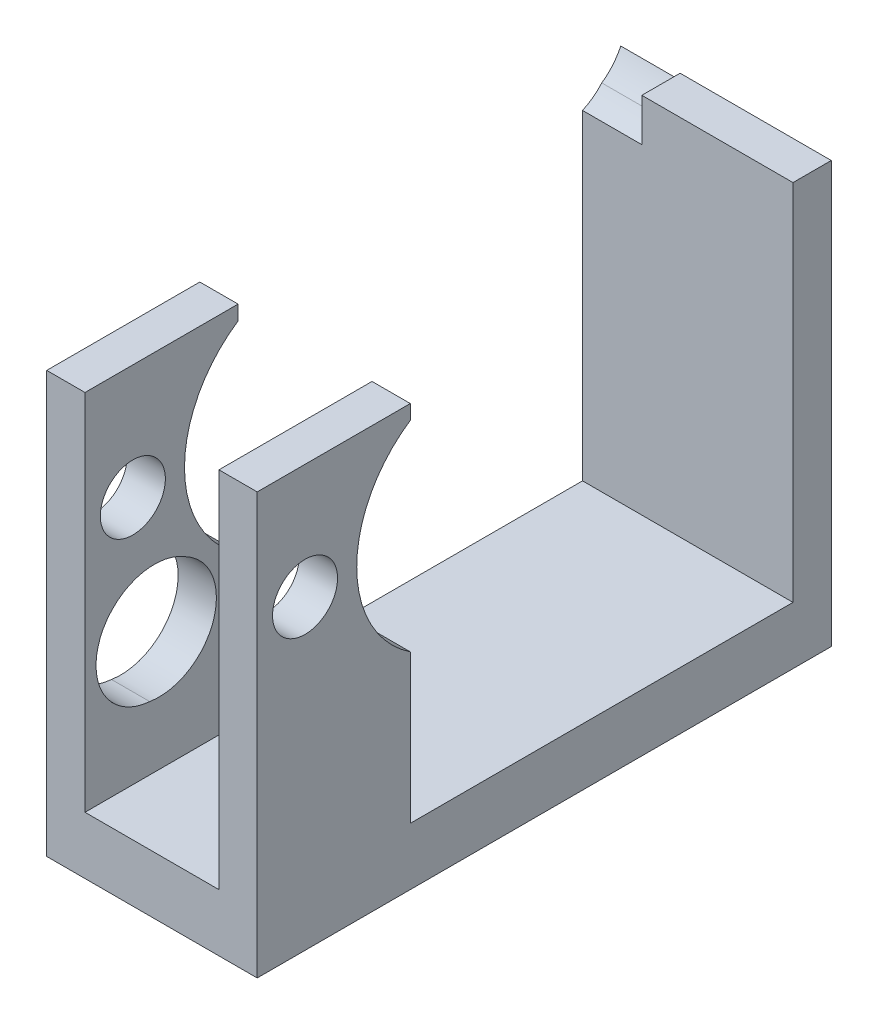
ISO-10303-21;
HEADER;
FILE_DESCRIPTION(('STEP AP214'),'2;1');
FILE_NAME('part.step','',(''),(''),'','','');
FILE_SCHEMA(('AUTOMOTIVE_DESIGN { 1 0 10303 214 1 1 1 1 }'));
ENDSEC;
DATA;
#1=APPLICATION_CONTEXT('core data for automotive mechanical design processes');
#2=APPLICATION_PROTOCOL_DEFINITION('international standard','automotive_design',2000,#1);
#3=PRODUCT_CONTEXT('',#1,'mechanical');
#4=PRODUCT('Part','Part','',(#3));
#5=PRODUCT_RELATED_PRODUCT_CATEGORY('part','',(#4));
#6=PRODUCT_DEFINITION_FORMATION('','',#4);
#7=PRODUCT_DEFINITION_CONTEXT('part definition',#1,'design');
#8=PRODUCT_DEFINITION('design','',#6,#7);
#9=PRODUCT_DEFINITION_SHAPE('','',#8);
#10=(LENGTH_UNIT() NAMED_UNIT(*) SI_UNIT(.MILLI.,.METRE.));
#11=(NAMED_UNIT(*) PLANE_ANGLE_UNIT() SI_UNIT($,.RADIAN.));
#12=(NAMED_UNIT(*) SI_UNIT($,.STERADIAN.) SOLID_ANGLE_UNIT());
#13=UNCERTAINTY_MEASURE_WITH_UNIT(LENGTH_MEASURE(1.E-05),#10,'distance_accuracy_value','');
#14=(GEOMETRIC_REPRESENTATION_CONTEXT(3) GLOBAL_UNCERTAINTY_ASSIGNED_CONTEXT((#13)) GLOBAL_UNIT_ASSIGNED_CONTEXT((#10,
#11,#12)) REPRESENTATION_CONTEXT('',''));
#15=CARTESIAN_POINT('',(0.,0.,0.));
#16=DIRECTION('',(0.,0.,1.));
#17=DIRECTION('',(1.,0.,0.));
#18=AXIS2_PLACEMENT_3D('',#15,#16,#17);
#19=CARTESIAN_POINT('',(-8.9,-35.7198777887695,-11.8675));
#20=DIRECTION('',(-1.,0.,0.));
#21=DIRECTION('',(0.,0.,1.));
#22=AXIS2_PLACEMENT_3D('',#19,#20,#21);
#23=CYLINDRICAL_SURFACE('',#22,3.);
#24=CARTESIAN_POINT('',(-10.,-35.7198777887695,-11.8675));
#25=DIRECTION('',(-1.,0.,0.));
#26=DIRECTION('',(0.,0.,1.));
#27=AXIS2_PLACEMENT_3D('',#24,#25,#26);
#28=CIRCLE('',#27,3.);
#29=CARTESIAN_POINT('',(-10.,-38.6800828893261,-11.3804827902028));
#30=VERTEX_POINT('',#29);
#31=CARTESIAN_POINT('',(-10.,-33.0507418472652,-13.2370668387377));
#32=VERTEX_POINT('',#31);
#33=EDGE_CURVE('E193',#30,#32,#28,.F.);
#34=ORIENTED_EDGE('',*,*,#33,.T.);
#35=DIRECTION('',(-1.,0.,0.));
#36=VECTOR('',#35,1.);
#37=CARTESIAN_POINT('',(-10.5,-33.0507418472652,-13.2370668387377));
#38=LINE('',#37,#36);
#39=CARTESIAN_POINT('',(-12.,-33.0507418472652,-13.2370668387377));
#40=VERTEX_POINT('',#39);
#41=EDGE_CURVE('E11',#32,#40,#38,.T.);
#42=ORIENTED_EDGE('',*,*,#41,.T.);
#43=CARTESIAN_POINT('',(-12.,-35.7198777887695,-11.8675));
#44=DIRECTION('',(1.,0.,0.));
#45=DIRECTION('',(0.,0.,-1.));
#46=AXIS2_PLACEMENT_3D('',#43,#44,#45);
#47=CIRCLE('',#46,3.);
#48=CARTESIAN_POINT('',(-12.,-38.6800828893261,-11.3804827902028));
#49=VERTEX_POINT('',#48);
#50=EDGE_CURVE('E191',#40,#49,#47,.F.);
#51=ORIENTED_EDGE('',*,*,#50,.T.);
#52=DIRECTION('',(-1.,0.,0.));
#53=VECTOR('',#52,1.);
#54=CARTESIAN_POINT('',(-10.5,-38.6800828893261,-11.3804827902028));
#55=LINE('',#54,#53);
#56=EDGE_CURVE('E47',#49,#30,#55,.F.);
#57=ORIENTED_EDGE('',*,*,#56,.T.);
#58=EDGE_LOOP('',(#34,#42,#51,#57));
#59=FACE_BOUND('',#58,.T.);
#60=ADVANCED_FACE('F41',(#59),#23,.F.);
#61=CARTESIAN_POINT('',(0.,0.,-38.));
#62=DIRECTION('',(0.,0.,1.));
#63=DIRECTION('',(1.,0.,0.));
#64=AXIS2_PLACEMENT_3D('',#61,#62,#63);
#65=PLANE('',#64);
#66=DIRECTION('',(-1.,0.,0.));
#67=VECTOR('',#66,1.);
#68=CARTESIAN_POINT('',(-8.9,-23.3190905958273,-38.));
#69=LINE('',#68,#67);
#70=CARTESIAN_POINT('',(-8.9,-23.3190905958273,-38.));
#71=VERTEX_POINT('',#70);
#72=CARTESIAN_POINT('',(-12.,-23.3190905958273,-38.));
#73=VERTEX_POINT('',#72);
#74=EDGE_CURVE('E197',#71,#73,#69,.T.);
#75=ORIENTED_EDGE('',*,*,#74,.F.);
#76=DIRECTION('',(0.,1.,0.));
#77=VECTOR('',#76,1.);
#78=CARTESIAN_POINT('',(-8.9,0.,-38.));
#79=LINE('',#78,#77);
#80=CARTESIAN_POINT('',(-8.9,-23.,-38.));
#81=VERTEX_POINT('',#80);
#82=EDGE_CURVE('E192',#71,#81,#79,.T.);
#83=ORIENTED_EDGE('',*,*,#82,.T.);
#84=DIRECTION('',(-1.,0.,0.));
#85=VECTOR('',#84,1.);
#86=CARTESIAN_POINT('',(-1.,-23.,-38.));
#87=LINE('',#86,#85);
#88=CARTESIAN_POINT('',(-1.,-23.,-38.));
#89=VERTEX_POINT('',#88);
#90=EDGE_CURVE('E302',#89,#81,#87,.T.);
#91=ORIENTED_EDGE('',*,*,#90,.F.);
#92=DIRECTION('',(0.,1.,0.));
#93=VECTOR('',#92,1.);
#94=CARTESIAN_POINT('',(-1.,-45.,-38.));
#95=LINE('',#94,#93);
#96=CARTESIAN_POINT('',(-1.,-45.,-38.));
#97=VERTEX_POINT('',#96);
#98=EDGE_CURVE('E267',#97,#89,#95,.T.);
#99=ORIENTED_EDGE('',*,*,#98,.F.);
#100=DIRECTION('',(1.,0.,0.));
#101=VECTOR('',#100,1.);
#102=CARTESIAN_POINT('',(-12.,-45.,-38.));
#103=LINE('',#102,#101);
#104=CARTESIAN_POINT('',(-12.,-45.,-38.));
#105=VERTEX_POINT('',#104);
#106=EDGE_CURVE('E266',#105,#97,#103,.T.);
#107=ORIENTED_EDGE('',*,*,#106,.F.);
#108=DIRECTION('',(0.,-1.,0.));
#109=VECTOR('',#108,1.);
#110=CARTESIAN_POINT('',(-12.,-42.,-38.));
#111=LINE('',#110,#109);
#112=EDGE_CURVE('E275',#73,#105,#111,.T.);
#113=ORIENTED_EDGE('',*,*,#112,.F.);
#114=EDGE_LOOP('',(#75,#83,#91,#99,#107,#113));
#115=FACE_BOUND('',#114,.T.);
#116=ADVANCED_FACE('F352',(#115),#65,.F.);
#117=CARTESIAN_POINT('',(-8.9,-22.5,-34.765));
#118=DIRECTION('',(-1.,0.,0.));
#119=DIRECTION('',(0.,0.,1.));
#120=AXIS2_PLACEMENT_3D('',#117,#118,#119);
#121=CYLINDRICAL_SURFACE('',#120,3.);
#122=CARTESIAN_POINT('',(-8.9,-22.5,-34.765));
#123=DIRECTION('',(1.,0.,0.));
#124=DIRECTION('',(0.,0.,-1.));
#125=AXIS2_PLACEMENT_3D('',#122,#123,#124);
#126=CIRCLE('',#125,3.);
#127=CARTESIAN_POINT('',(-8.9,-25.23400347476,-36.));
#128=VERTEX_POINT('',#127);
#129=CARTESIAN_POINT('',(-8.9,-24.4926321294143,-37.007636215891));
#130=VERTEX_POINT('',#129);
#131=EDGE_CURVE('E196',#128,#130,#126,.T.);
#132=ORIENTED_EDGE('',*,*,#131,.T.);
#133=DIRECTION('',(-1.,0.,0.));
#134=VECTOR('',#133,1.);
#135=CARTESIAN_POINT('',(-10.5,-24.4926321294143,-37.007636215891));
#136=LINE('',#135,#134);
#137=CARTESIAN_POINT('',(-12.,-24.4926321294143,-37.007636215891));
#138=VERTEX_POINT('',#137);
#139=EDGE_CURVE('E339',#130,#138,#136,.T.);
#140=ORIENTED_EDGE('',*,*,#139,.T.);
#141=CARTESIAN_POINT('',(-12.,-22.5,-34.765));
#142=DIRECTION('',(1.,0.,0.));
#143=DIRECTION('',(0.,0.,-1.));
#144=AXIS2_PLACEMENT_3D('',#141,#142,#143);
#145=CIRCLE('',#144,3.);
#146=CARTESIAN_POINT('',(-12.,-25.23400347476,-36.));
#147=VERTEX_POINT('',#146);
#148=EDGE_CURVE('E332',#138,#147,#145,.F.);
#149=ORIENTED_EDGE('',*,*,#148,.T.);
#150=DIRECTION('',(-1.,0.,0.));
#151=VECTOR('',#150,1.);
#152=CARTESIAN_POINT('',(-8.9,-25.23400347476,-36.));
#153=LINE('',#152,#151);
#154=EDGE_CURVE('E208',#128,#147,#153,.T.);
#155=ORIENTED_EDGE('',*,*,#154,.F.);
#156=EDGE_LOOP('',(#132,#140,#149,#155));
#157=FACE_BOUND('',#156,.T.);
#158=ADVANCED_FACE('F408',(#157),#121,.F.);
#159=CARTESIAN_POINT('',(0.,0.,-36.));
#160=DIRECTION('',(0.,0.,1.));
#161=DIRECTION('',(1.,0.,0.));
#162=AXIS2_PLACEMENT_3D('',#159,#160,#161);
#163=PLANE('',#162);
#164=DIRECTION('',(0.,1.,0.));
#165=VECTOR('',#164,1.);
#166=CARTESIAN_POINT('',(-8.9,0.,-36.));
#167=LINE('',#166,#165);
#168=CARTESIAN_POINT('',(-8.9,-23.,-36.));
#169=VERTEX_POINT('',#168);
#170=EDGE_CURVE('E335',#128,#169,#167,.T.);
#171=ORIENTED_EDGE('',*,*,#170,.F.);
#172=ORIENTED_EDGE('',*,*,#154,.T.);
#173=DIRECTION('',(0.,-1.,0.));
#174=VECTOR('',#173,1.);
#175=CARTESIAN_POINT('',(-12.,-23.,-36.));
#176=LINE('',#175,#174);
#177=CARTESIAN_POINT('',(-12.,-42.,-36.));
#178=VERTEX_POINT('',#177);
#179=EDGE_CURVE('E310',#147,#178,#176,.T.);
#180=ORIENTED_EDGE('',*,*,#179,.T.);
#181=DIRECTION('',(-1.,0.,0.));
#182=VECTOR('',#181,1.);
#183=CARTESIAN_POINT('',(-1.,-42.,-36.));
#184=LINE('',#183,#182);
#185=CARTESIAN_POINT('',(-1.,-42.,-36.));
#186=VERTEX_POINT('',#185);
#187=EDGE_CURVE('E300',#186,#178,#184,.T.);
#188=ORIENTED_EDGE('',*,*,#187,.F.);
#189=DIRECTION('',(0.,1.,0.));
#190=VECTOR('',#189,1.);
#191=CARTESIAN_POINT('',(-1.,-45.,-36.));
#192=LINE('',#191,#190);
#193=CARTESIAN_POINT('',(-1.,-23.,-36.));
#194=VERTEX_POINT('',#193);
#195=EDGE_CURVE('E311',#186,#194,#192,.T.);
#196=ORIENTED_EDGE('',*,*,#195,.T.);
#197=DIRECTION('',(-1.,0.,0.));
#198=VECTOR('',#197,1.);
#199=CARTESIAN_POINT('',(-1.,-23.,-36.));
#200=LINE('',#199,#198);
#201=EDGE_CURVE('E303',#194,#169,#200,.T.);
#202=ORIENTED_EDGE('',*,*,#201,.T.);
#203=EDGE_LOOP('',(#171,#172,#180,#188,#196,#202));
#204=FACE_BOUND('',#203,.T.);
#205=ADVANCED_FACE('F400',(#204),#163,.T.);
#206=CARTESIAN_POINT('',(-1.,-23.,-36.));
#207=DIRECTION('',(0.,-1.,0.));
#208=DIRECTION('',(0.,0.,-1.));
#209=AXIS2_PLACEMENT_3D('',#206,#207,#208);
#210=PLANE('',#209);
#211=ORIENTED_EDGE('',*,*,#90,.T.);
#212=DIRECTION('',(0.,0.,1.));
#213=VECTOR('',#212,1.);
#214=CARTESIAN_POINT('',(-8.9,-23.,-36.));
#215=LINE('',#214,#213);
#216=EDGE_CURVE('E189',#81,#169,#215,.T.);
#217=ORIENTED_EDGE('',*,*,#216,.T.);
#218=ORIENTED_EDGE('',*,*,#201,.F.);
#219=DIRECTION('',(0.,0.,-1.));
#220=VECTOR('',#219,1.);
#221=CARTESIAN_POINT('',(-1.,-23.,-36.));
#222=LINE('',#221,#220);
#223=EDGE_CURVE('E297',#194,#89,#222,.T.);
#224=ORIENTED_EDGE('',*,*,#223,.T.);
#225=EDGE_LOOP('',(#211,#217,#218,#224));
#226=FACE_BOUND('',#225,.T.);
#227=ADVANCED_FACE('F409',(#226),#210,.F.);
#228=CARTESIAN_POINT('',(0.,0.,-16.));
#229=DIRECTION('',(0.,0.,1.));
#230=DIRECTION('',(1.,0.,0.));
#231=AXIS2_PLACEMENT_3D('',#228,#229,#230);
#232=PLANE('',#231);
#233=DIRECTION('',(-1.,0.,0.));
#234=VECTOR('',#233,1.);
#235=CARTESIAN_POINT('',(-0.799999999999999,-23.7616796585165,-16.));
#236=LINE('',#235,#234);
#237=CARTESIAN_POINT('',(-12.,-23.7616796585165,-16.));
#238=VERTEX_POINT('',#237);
#239=CARTESIAN_POINT('',(-10.,-23.7616796585165,-16.));
#240=VERTEX_POINT('',#239);
#241=EDGE_CURVE('E314',#238,#240,#236,.F.);
#242=ORIENTED_EDGE('',*,*,#241,.F.);
#243=DIRECTION('',(0.,-1.,0.));
#244=VECTOR('',#243,1.);
#245=CARTESIAN_POINT('',(-12.,-23.,-16.));
#246=LINE('',#245,#244);
#247=CARTESIAN_POINT('',(-12.,-23.,-16.));
#248=VERTEX_POINT('',#247);
#249=EDGE_CURVE('E242',#248,#238,#246,.T.);
#250=ORIENTED_EDGE('',*,*,#249,.F.);
#251=DIRECTION('',(-1.,0.,0.));
#252=VECTOR('',#251,1.);
#253=CARTESIAN_POINT('',(-10.,-23.,-16.));
#254=LINE('',#253,#252);
#255=CARTESIAN_POINT('',(-10.,-23.,-16.));
#256=VERTEX_POINT('',#255);
#257=EDGE_CURVE('E240',#256,#248,#254,.T.);
#258=ORIENTED_EDGE('',*,*,#257,.F.);
#259=DIRECTION('',(0.,1.,0.));
#260=VECTOR('',#259,1.);
#261=CARTESIAN_POINT('',(-10.,-45.,-16.));
#262=LINE('',#261,#260);
#263=EDGE_CURVE('E243',#240,#256,#262,.T.);
#264=ORIENTED_EDGE('',*,*,#263,.F.);
#265=EDGE_LOOP('',(#242,#250,#258,#264));
#266=FACE_BOUND('',#265,.T.);
#267=ADVANCED_FACE('F374',(#266),#232,.F.);
#268=DIRECTION('',(-1.,0.,0.));
#269=VECTOR('',#268,1.);
#270=CARTESIAN_POINT('',(-0.799999999999999,-34.2383203414835,-16.));
#271=LINE('',#270,#269);
#272=CARTESIAN_POINT('',(-10.,-34.2383203414835,-16.));
#273=VERTEX_POINT('',#272);
#274=CARTESIAN_POINT('',(-12.,-34.2383203414835,-16.));
#275=VERTEX_POINT('',#274);
#276=EDGE_CURVE('E320',#273,#275,#271,.T.);
#277=ORIENTED_EDGE('',*,*,#276,.F.);
#278=CARTESIAN_POINT('',(-10.,-42.,-16.));
#279=VERTEX_POINT('',#278);
#280=EDGE_CURVE('E239',#279,#273,#262,.T.);
#281=ORIENTED_EDGE('',*,*,#280,.F.);
#282=DIRECTION('',(1.,0.,0.));
#283=VECTOR('',#282,1.);
#284=CARTESIAN_POINT('',(0.,-42.,-16.));
#285=LINE('',#284,#283);
#286=CARTESIAN_POINT('',(-12.,-42.,-16.));
#287=VERTEX_POINT('',#286);
#288=EDGE_CURVE('E221',#287,#279,#285,.T.);
#289=ORIENTED_EDGE('',*,*,#288,.F.);
#290=EDGE_CURVE('E250',#275,#287,#246,.T.);
#291=ORIENTED_EDGE('',*,*,#290,.F.);
#292=EDGE_LOOP('',(#277,#281,#289,#291));
#293=FACE_BOUND('',#292,.T.);
#294=ADVANCED_FACE('F390',(#293),#232,.F.);
#295=CARTESIAN_POINT('',(0.,0.,-16.));
#296=DIRECTION('',(0.,0.,1.));
#297=DIRECTION('',(1.,0.,0.));
#298=AXIS2_PLACEMENT_3D('',#295,#296,#297);
#299=PLANE('',#298);
#300=DIRECTION('',(-1.,0.,0.));
#301=VECTOR('',#300,1.);
#302=CARTESIAN_POINT('',(-0.799999999999999,-23.7616796585165,-16.));
#303=LINE('',#302,#301);
#304=CARTESIAN_POINT('',(-3.,-23.7616796585165,-16.));
#305=VERTEX_POINT('',#304);
#306=CARTESIAN_POINT('',(-1.,-23.7616796585165,-16.));
#307=VERTEX_POINT('',#306);
#308=EDGE_CURVE('E203',#305,#307,#303,.F.);
#309=ORIENTED_EDGE('',*,*,#308,.F.);
#310=DIRECTION('',(0.,-1.,0.));
#311=VECTOR('',#310,1.);
#312=CARTESIAN_POINT('',(-3.,-23.,-16.));
#313=LINE('',#312,#311);
#314=CARTESIAN_POINT('',(-3.,-23.,-16.));
#315=VERTEX_POINT('',#314);
#316=EDGE_CURVE('E288',#315,#305,#313,.T.);
#317=ORIENTED_EDGE('',*,*,#316,.F.);
#318=DIRECTION('',(-1.,0.,0.));
#319=VECTOR('',#318,1.);
#320=CARTESIAN_POINT('',(-1.,-23.,-16.));
#321=LINE('',#320,#319);
#322=CARTESIAN_POINT('',(-1.,-23.,-16.));
#323=VERTEX_POINT('',#322);
#324=EDGE_CURVE('E285',#323,#315,#321,.T.);
#325=ORIENTED_EDGE('',*,*,#324,.F.);
#326=DIRECTION('',(0.,1.,0.));
#327=VECTOR('',#326,1.);
#328=CARTESIAN_POINT('',(-1.,-45.,-16.));
#329=LINE('',#328,#327);
#330=EDGE_CURVE('E286',#307,#323,#329,.T.);
#331=ORIENTED_EDGE('',*,*,#330,.F.);
#332=EDGE_LOOP('',(#309,#317,#325,#331));
#333=FACE_BOUND('',#332,.T.);
#334=ADVANCED_FACE('F449',(#333),#299,.F.);
#335=DIRECTION('',(-1.,0.,0.));
#336=VECTOR('',#335,1.);
#337=CARTESIAN_POINT('',(-0.799999999999999,-34.2383203414835,-16.));
#338=LINE('',#337,#336);
#339=CARTESIAN_POINT('',(-1.,-34.2383203414835,-16.));
#340=VERTEX_POINT('',#339);
#341=CARTESIAN_POINT('',(-3.,-34.2383203414835,-16.));
#342=VERTEX_POINT('',#341);
#343=EDGE_CURVE('E219',#340,#342,#338,.T.);
#344=ORIENTED_EDGE('',*,*,#343,.F.);
#345=CARTESIAN_POINT('',(-1.,-42.,-16.));
#346=VERTEX_POINT('',#345);
#347=EDGE_CURVE('E287',#346,#340,#329,.T.);
#348=ORIENTED_EDGE('',*,*,#347,.F.);
#349=DIRECTION('',(-1.,0.,0.));
#350=VECTOR('',#349,1.);
#351=CARTESIAN_POINT('',(-1.,-42.,-16.));
#352=LINE('',#351,#350);
#353=CARTESIAN_POINT('',(-3.,-42.,-16.));
#354=VERTEX_POINT('',#353);
#355=EDGE_CURVE('E222',#346,#354,#352,.T.);
#356=ORIENTED_EDGE('',*,*,#355,.T.);
#357=EDGE_CURVE('E291',#342,#354,#313,.T.);
#358=ORIENTED_EDGE('',*,*,#357,.F.);
#359=EDGE_LOOP('',(#344,#348,#356,#358));
#360=FACE_BOUND('',#359,.T.);
#361=ADVANCED_FACE('F454',(#360),#299,.F.);
#362=CARTESIAN_POINT('',(-1.,-42.,-8.));
#363=DIRECTION('',(0.,-1.,0.));
#364=DIRECTION('',(0.,0.,-1.));
#365=AXIS2_PLACEMENT_3D('',#362,#363,#364);
#366=PLANE('',#365);
#367=DIRECTION('',(0.,0.,-1.));
#368=VECTOR('',#367,1.);
#369=CARTESIAN_POINT('',(-1.,-42.,-8.));
#370=LINE('',#369,#368);
#371=EDGE_CURVE('E258',#346,#186,#370,.T.);
#372=ORIENTED_EDGE('',*,*,#371,.T.);
#373=ORIENTED_EDGE('',*,*,#187,.T.);
#374=DIRECTION('',(0.,0.,-1.));
#375=VECTOR('',#374,1.);
#376=CARTESIAN_POINT('',(-12.,-42.,-8.));
#377=LINE('',#376,#375);
#378=EDGE_CURVE('E261',#287,#178,#377,.T.);
#379=ORIENTED_EDGE('',*,*,#378,.F.);
#380=ORIENTED_EDGE('',*,*,#288,.T.);
#381=DIRECTION('',(0.,0.,1.));
#382=VECTOR('',#381,1.);
#383=CARTESIAN_POINT('',(-10.,-42.,-8.));
#384=LINE('',#383,#382);
#385=CARTESIAN_POINT('',(-10.,-42.,-8.));
#386=VERTEX_POINT('',#385);
#387=EDGE_CURVE('E251',#279,#386,#384,.T.);
#388=ORIENTED_EDGE('',*,*,#387,.T.);
#389=DIRECTION('',(-1.,0.,0.));
#390=VECTOR('',#389,1.);
#391=CARTESIAN_POINT('',(-1.,-42.,-8.));
#392=LINE('',#391,#390);
#393=CARTESIAN_POINT('',(-3.,-42.,-8.));
#394=VERTEX_POINT('',#393);
#395=EDGE_CURVE('E262',#394,#386,#392,.T.);
#396=ORIENTED_EDGE('',*,*,#395,.F.);
#397=DIRECTION('',(0.,0.,1.));
#398=VECTOR('',#397,1.);
#399=CARTESIAN_POINT('',(-3.,-42.,-8.));
#400=LINE('',#399,#398);
#401=EDGE_CURVE('E220',#354,#394,#400,.T.);
#402=ORIENTED_EDGE('',*,*,#401,.F.);
#403=ORIENTED_EDGE('',*,*,#355,.F.);
#404=EDGE_LOOP('',(#372,#373,#379,#380,#388,#396,#402,#403));
#405=FACE_BOUND('',#404,.T.);
#406=ADVANCED_FACE('F395',(#405),#366,.F.);
#407=CARTESIAN_POINT('',(-10.,-45.,-8.));
#408=DIRECTION('',(-1.,0.,0.));
#409=DIRECTION('',(0.,0.,1.));
#410=AXIS2_PLACEMENT_3D('',#407,#408,#409);
#411=PLANE('',#410);
#412=CARTESIAN_POINT('',(-10.,-35.6399001096049,-11.625));
#413=DIRECTION('',(-1.,0.,0.));
#414=DIRECTION('',(0.,0.,1.));
#415=AXIS2_PLACEMENT_3D('',#412,#413,#414);
#416=CIRCLE('',#415,3.05);
#417=EDGE_CURVE('E57',#32,#30,#416,.F.);
#418=ORIENTED_EDGE('',*,*,#417,.F.);
#419=ORIENTED_EDGE('',*,*,#33,.F.);
#420=EDGE_LOOP('',(#418,#419));
#421=FACE_BOUND('',#420,.T.);
#422=CARTESIAN_POINT('',(-10.,-29.,-10.5));
#423=DIRECTION('',(-1.,0.,0.));
#424=DIRECTION('',(0.,0.,1.));
#425=AXIS2_PLACEMENT_3D('',#422,#423,#424);
#426=CIRCLE('',#425,1.7);
#427=CARTESIAN_POINT('',(-10.,-29.,-8.8));
#428=VERTEX_POINT('',#427);
#429=EDGE_CURVE('E213',#428,#428,#426,.F.);
#430=ORIENTED_EDGE('',*,*,#429,.F.);
#431=EDGE_LOOP('',(#430));
#432=FACE_BOUND('',#431,.T.);
#433=CARTESIAN_POINT('',(-10.,-29.,-19.5));
#434=DIRECTION('',(-1.,0.,0.));
#435=DIRECTION('',(0.,0.,1.));
#436=AXIS2_PLACEMENT_3D('',#433,#434,#435);
#437=CIRCLE('',#436,6.3);
#438=EDGE_CURVE('E308',#240,#273,#437,.F.);
#439=ORIENTED_EDGE('',*,*,#438,.F.);
#440=ORIENTED_EDGE('',*,*,#263,.T.);
#441=DIRECTION('',(0.,0.,-1.));
#442=VECTOR('',#441,1.);
#443=CARTESIAN_POINT('',(-10.,-23.,-8.));
#444=LINE('',#443,#442);
#445=CARTESIAN_POINT('',(-10.,-23.,-8.));
#446=VERTEX_POINT('',#445);
#447=EDGE_CURVE('E229',#446,#256,#444,.T.);
#448=ORIENTED_EDGE('',*,*,#447,.F.);
#449=DIRECTION('',(0.,1.,0.));
#450=VECTOR('',#449,1.);
#451=CARTESIAN_POINT('',(-10.,-45.,-8.));
#452=LINE('',#451,#450);
#453=EDGE_CURVE('E248',#386,#446,#452,.T.);
#454=ORIENTED_EDGE('',*,*,#453,.F.);
#455=ORIENTED_EDGE('',*,*,#387,.F.);
#456=ORIENTED_EDGE('',*,*,#280,.T.);
#457=EDGE_LOOP('',(#439,#440,#448,#454,#455,#456));
#458=FACE_BOUND('',#457,.T.);
#459=ADVANCED_FACE('F385',(#421,#432,#458),#411,.F.);
#460=CARTESIAN_POINT('',(-12.,-23.,-8.));
#461=DIRECTION('',(1.,0.,0.));
#462=DIRECTION('',(0.,0.,-1.));
#463=AXIS2_PLACEMENT_3D('',#460,#461,#462);
#464=PLANE('',#463);
#465=CARTESIAN_POINT('',(-12.,-35.6399001096049,-11.625));
#466=DIRECTION('',(1.,0.,0.));
#467=DIRECTION('',(0.,0.,-1.));
#468=AXIS2_PLACEMENT_3D('',#465,#466,#467);
#469=CIRCLE('',#468,3.05);
#470=EDGE_CURVE('E182',#49,#40,#469,.F.);
#471=ORIENTED_EDGE('',*,*,#470,.F.);
#472=ORIENTED_EDGE('',*,*,#50,.F.);
#473=EDGE_LOOP('',(#471,#472));
#474=FACE_BOUND('',#473,.T.);
#475=CARTESIAN_POINT('',(-12.,-22.,-35.25));
#476=DIRECTION('',(1.,0.,0.));
#477=DIRECTION('',(0.,0.,-1.));
#478=AXIS2_PLACEMENT_3D('',#475,#476,#477);
#479=CIRCLE('',#478,3.05);
#480=EDGE_CURVE('E63',#73,#138,#479,.F.);
#481=ORIENTED_EDGE('',*,*,#480,.F.);
#482=ORIENTED_EDGE('',*,*,#112,.T.);
#483=DIRECTION('',(0.,0.,-1.));
#484=VECTOR('',#483,1.);
#485=CARTESIAN_POINT('',(-12.,-45.,-8.));
#486=LINE('',#485,#484);
#487=CARTESIAN_POINT('',(-12.,-45.,-8.));
#488=VERTEX_POINT('',#487);
#489=EDGE_CURVE('E227',#488,#105,#486,.T.);
#490=ORIENTED_EDGE('',*,*,#489,.F.);
#491=DIRECTION('',(0.,-1.,0.));
#492=VECTOR('',#491,1.);
#493=CARTESIAN_POINT('',(-12.,-23.,-8.));
#494=LINE('',#493,#492);
#495=CARTESIAN_POINT('',(-12.,-23.,-8.));
#496=VERTEX_POINT('',#495);
#497=EDGE_CURVE('E237',#496,#488,#494,.T.);
#498=ORIENTED_EDGE('',*,*,#497,.F.);
#499=DIRECTION('',(0.,0.,-1.));
#500=VECTOR('',#499,1.);
#501=CARTESIAN_POINT('',(-12.,-23.,-8.));
#502=LINE('',#501,#500);
#503=EDGE_CURVE('E231',#496,#248,#502,.T.);
#504=ORIENTED_EDGE('',*,*,#503,.T.);
#505=ORIENTED_EDGE('',*,*,#249,.T.);
#506=CARTESIAN_POINT('',(-12.,-29.,-19.5));
#507=DIRECTION('',(1.,0.,0.));
#508=DIRECTION('',(0.,0.,-1.));
#509=AXIS2_PLACEMENT_3D('',#506,#507,#508);
#510=CIRCLE('',#509,6.3);
#511=EDGE_CURVE('E316',#275,#238,#510,.F.);
#512=ORIENTED_EDGE('',*,*,#511,.F.);
#513=ORIENTED_EDGE('',*,*,#290,.T.);
#514=ORIENTED_EDGE('',*,*,#378,.T.);
#515=ORIENTED_EDGE('',*,*,#179,.F.);
#516=ORIENTED_EDGE('',*,*,#148,.F.);
#517=EDGE_LOOP('',(#481,#482,#490,#498,#504,#505,#512,#513,#514,#515,#516));
#518=FACE_BOUND('',#517,.T.);
#519=CARTESIAN_POINT('',(-12.,-29.,-10.5));
#520=DIRECTION('',(1.,0.,0.));
#521=DIRECTION('',(0.,0.,-1.));
#522=AXIS2_PLACEMENT_3D('',#519,#520,#521);
#523=CIRCLE('',#522,1.7);
#524=CARTESIAN_POINT('',(-12.,-29.,-12.2));
#525=VERTEX_POINT('',#524);
#526=EDGE_CURVE('E214',#525,#525,#523,.F.);
#527=ORIENTED_EDGE('',*,*,#526,.F.);
#528=EDGE_LOOP('',(#527));
#529=FACE_BOUND('',#528,.T.);
#530=ADVANCED_FACE('F43',(#474,#518,#529),#464,.F.);
#531=CARTESIAN_POINT('',(-12.,-45.,-8.));
#532=DIRECTION('',(0.,1.,0.));
#533=DIRECTION('',(0.,0.,1.));
#534=AXIS2_PLACEMENT_3D('',#531,#532,#533);
#535=PLANE('',#534);
#536=ORIENTED_EDGE('',*,*,#489,.T.);
#537=ORIENTED_EDGE('',*,*,#106,.T.);
#538=DIRECTION('',(0.,0.,-1.));
#539=VECTOR('',#538,1.);
#540=CARTESIAN_POINT('',(-1.,-45.,-8.));
#541=LINE('',#540,#539);
#542=CARTESIAN_POINT('',(-1.,-45.,-8.));
#543=VERTEX_POINT('',#542);
#544=EDGE_CURVE('E256',#543,#97,#541,.T.);
#545=ORIENTED_EDGE('',*,*,#544,.F.);
#546=DIRECTION('',(1.,0.,0.));
#547=VECTOR('',#546,1.);
#548=CARTESIAN_POINT('',(-12.,-45.,-8.));
#549=LINE('',#548,#547);
#550=EDGE_CURVE('E252',#488,#543,#549,.T.);
#551=ORIENTED_EDGE('',*,*,#550,.F.);
#552=EDGE_LOOP('',(#536,#537,#545,#551));
#553=FACE_BOUND('',#552,.T.);
#554=ADVANCED_FACE('F363',(#553),#535,.F.);
#555=CARTESIAN_POINT('',(-10.,-23.,-8.));
#556=DIRECTION('',(0.,-1.,0.));
#557=DIRECTION('',(0.,0.,-1.));
#558=AXIS2_PLACEMENT_3D('',#555,#556,#557);
#559=PLANE('',#558);
#560=ORIENTED_EDGE('',*,*,#257,.T.);
#561=ORIENTED_EDGE('',*,*,#503,.F.);
#562=DIRECTION('',(-1.,0.,0.));
#563=VECTOR('',#562,1.);
#564=CARTESIAN_POINT('',(-10.,-23.,-8.));
#565=LINE('',#564,#563);
#566=EDGE_CURVE('E236',#446,#496,#565,.T.);
#567=ORIENTED_EDGE('',*,*,#566,.F.);
#568=ORIENTED_EDGE('',*,*,#447,.T.);
#569=EDGE_LOOP('',(#560,#561,#567,#568));
#570=FACE_BOUND('',#569,.T.);
#571=ADVANCED_FACE('F470',(#570),#559,.F.);
#572=CARTESIAN_POINT('',(0.,0.,-8.));
#573=DIRECTION('',(0.,0.,1.));
#574=DIRECTION('',(1.,0.,0.));
#575=AXIS2_PLACEMENT_3D('',#572,#573,#574);
#576=PLANE('',#575);
#577=ORIENTED_EDGE('',*,*,#550,.T.);
#578=DIRECTION('',(0.,1.,0.));
#579=VECTOR('',#578,1.);
#580=CARTESIAN_POINT('',(-1.,-45.,-8.));
#581=LINE('',#580,#579);
#582=CARTESIAN_POINT('',(-1.,-23.,-8.));
#583=VERTEX_POINT('',#582);
#584=EDGE_CURVE('E270',#543,#583,#581,.T.);
#585=ORIENTED_EDGE('',*,*,#584,.T.);
#586=DIRECTION('',(-1.,0.,0.));
#587=VECTOR('',#586,1.);
#588=CARTESIAN_POINT('',(-1.,-23.,-8.));
#589=LINE('',#588,#587);
#590=CARTESIAN_POINT('',(-3.,-23.,-8.));
#591=VERTEX_POINT('',#590);
#592=EDGE_CURVE('E281',#583,#591,#589,.T.);
#593=ORIENTED_EDGE('',*,*,#592,.T.);
#594=DIRECTION('',(0.,-1.,0.));
#595=VECTOR('',#594,1.);
#596=CARTESIAN_POINT('',(-3.,-23.,-8.));
#597=LINE('',#596,#595);
#598=EDGE_CURVE('E282',#591,#394,#597,.T.);
#599=ORIENTED_EDGE('',*,*,#598,.T.);
#600=ORIENTED_EDGE('',*,*,#395,.T.);
#601=ORIENTED_EDGE('',*,*,#453,.T.);
#602=ORIENTED_EDGE('',*,*,#566,.T.);
#603=ORIENTED_EDGE('',*,*,#497,.T.);
#604=EDGE_LOOP('',(#577,#585,#593,#599,#600,#601,#602,#603));
#605=FACE_BOUND('',#604,.T.);
#606=ADVANCED_FACE('F362',(#605),#576,.T.);
#607=CARTESIAN_POINT('',(-1.,-45.,-8.));
#608=DIRECTION('',(-1.,0.,0.));
#609=DIRECTION('',(0.,0.,1.));
#610=AXIS2_PLACEMENT_3D('',#607,#608,#609);
#611=PLANE('',#610);
#612=CARTESIAN_POINT('',(-1.,-29.,-10.5));
#613=DIRECTION('',(-1.,0.,0.));
#614=DIRECTION('',(0.,0.,1.));
#615=AXIS2_PLACEMENT_3D('',#612,#613,#614);
#616=CIRCLE('',#615,1.7);
#617=CARTESIAN_POINT('',(-1.,-29.,-8.8));
#618=VERTEX_POINT('',#617);
#619=EDGE_CURVE('E209',#618,#618,#616,.F.);
#620=ORIENTED_EDGE('',*,*,#619,.F.);
#621=EDGE_LOOP('',(#620));
#622=FACE_BOUND('',#621,.T.);
#623=CARTESIAN_POINT('',(-1.,-29.,-19.5));
#624=DIRECTION('',(-1.,0.,0.));
#625=DIRECTION('',(0.,0.,1.));
#626=AXIS2_PLACEMENT_3D('',#623,#624,#625);
#627=CIRCLE('',#626,6.3);
#628=EDGE_CURVE('E324',#307,#340,#627,.F.);
#629=ORIENTED_EDGE('',*,*,#628,.F.);
#630=ORIENTED_EDGE('',*,*,#330,.T.);
#631=DIRECTION('',(0.,0.,-1.));
#632=VECTOR('',#631,1.);
#633=CARTESIAN_POINT('',(-1.,-23.,-8.));
#634=LINE('',#633,#632);
#635=EDGE_CURVE('E274',#583,#323,#634,.T.);
#636=ORIENTED_EDGE('',*,*,#635,.F.);
#637=ORIENTED_EDGE('',*,*,#584,.F.);
#638=ORIENTED_EDGE('',*,*,#544,.T.);
#639=ORIENTED_EDGE('',*,*,#98,.T.);
#640=ORIENTED_EDGE('',*,*,#223,.F.);
#641=ORIENTED_EDGE('',*,*,#195,.F.);
#642=ORIENTED_EDGE('',*,*,#371,.F.);
#643=ORIENTED_EDGE('',*,*,#347,.T.);
#644=EDGE_LOOP('',(#629,#630,#636,#637,#638,#639,#640,#641,#642,#643));
#645=FACE_BOUND('',#644,.T.);
#646=ADVANCED_FACE('F405',(#622,#645),#611,.F.);
#647=CARTESIAN_POINT('',(-3.,-23.,-8.));
#648=DIRECTION('',(1.,0.,0.));
#649=DIRECTION('',(0.,0.,-1.));
#650=AXIS2_PLACEMENT_3D('',#647,#648,#649);
#651=PLANE('',#650);
#652=CARTESIAN_POINT('',(-3.,-29.,-10.5));
#653=DIRECTION('',(1.,0.,0.));
#654=DIRECTION('',(0.,0.,-1.));
#655=AXIS2_PLACEMENT_3D('',#652,#653,#654);
#656=CIRCLE('',#655,1.7);
#657=CARTESIAN_POINT('',(-3.,-29.,-12.2));
#658=VERTEX_POINT('',#657);
#659=EDGE_CURVE('E207',#658,#658,#656,.F.);
#660=ORIENTED_EDGE('',*,*,#659,.F.);
#661=EDGE_LOOP('',(#660));
#662=FACE_BOUND('',#661,.T.);
#663=CARTESIAN_POINT('',(-3.,-29.,-19.5));
#664=DIRECTION('',(1.,0.,0.));
#665=DIRECTION('',(0.,0.,-1.));
#666=AXIS2_PLACEMENT_3D('',#663,#664,#665);
#667=CIRCLE('',#666,6.3);
#668=EDGE_CURVE('E325',#342,#305,#667,.F.);
#669=ORIENTED_EDGE('',*,*,#668,.F.);
#670=ORIENTED_EDGE('',*,*,#357,.T.);
#671=ORIENTED_EDGE('',*,*,#401,.T.);
#672=ORIENTED_EDGE('',*,*,#598,.F.);
#673=DIRECTION('',(0.,0.,-1.));
#674=VECTOR('',#673,1.);
#675=CARTESIAN_POINT('',(-3.,-23.,-8.));
#676=LINE('',#675,#674);
#677=EDGE_CURVE('E278',#591,#315,#676,.T.);
#678=ORIENTED_EDGE('',*,*,#677,.T.);
#679=ORIENTED_EDGE('',*,*,#316,.T.);
#680=EDGE_LOOP('',(#669,#670,#671,#672,#678,#679));
#681=FACE_BOUND('',#680,.T.);
#682=ADVANCED_FACE('F459',(#662,#681),#651,.F.);
#683=CARTESIAN_POINT('',(-1.,-23.,-8.));
#684=DIRECTION('',(0.,-1.,0.));
#685=DIRECTION('',(0.,0.,-1.));
#686=AXIS2_PLACEMENT_3D('',#683,#684,#685);
#687=PLANE('',#686);
#688=ORIENTED_EDGE('',*,*,#324,.T.);
#689=ORIENTED_EDGE('',*,*,#677,.F.);
#690=ORIENTED_EDGE('',*,*,#592,.F.);
#691=ORIENTED_EDGE('',*,*,#635,.T.);
#692=EDGE_LOOP('',(#688,#689,#690,#691));
#693=FACE_BOUND('',#692,.T.);
#694=ADVANCED_FACE('F455',(#693),#687,.F.);
#695=CARTESIAN_POINT('',(-0.799999999999999,-29.,-19.5));
#696=DIRECTION('',(-1.,0.,0.));
#697=DIRECTION('',(0.,0.,1.));
#698=AXIS2_PLACEMENT_3D('',#695,#696,#697);
#699=CYLINDRICAL_SURFACE('',#698,6.3);
#700=ORIENTED_EDGE('',*,*,#308,.T.);
#701=ORIENTED_EDGE('',*,*,#628,.T.);
#702=ORIENTED_EDGE('',*,*,#343,.T.);
#703=ORIENTED_EDGE('',*,*,#668,.T.);
#704=EDGE_LOOP('',(#700,#701,#702,#703));
#705=FACE_BOUND('',#704,.T.);
#706=ADVANCED_FACE('F444',(#705),#699,.F.);
#707=ORIENTED_EDGE('',*,*,#438,.T.);
#708=ORIENTED_EDGE('',*,*,#276,.T.);
#709=ORIENTED_EDGE('',*,*,#511,.T.);
#710=ORIENTED_EDGE('',*,*,#241,.T.);
#711=EDGE_LOOP('',(#707,#708,#709,#710));
#712=FACE_BOUND('',#711,.T.);
#713=ADVANCED_FACE('F378',(#712),#699,.F.);
#714=CARTESIAN_POINT('',(-9.8,-29.,-10.5));
#715=DIRECTION('',(-1.,0.,0.));
#716=DIRECTION('',(0.,0.,1.));
#717=AXIS2_PLACEMENT_3D('',#714,#715,#716);
#718=CYLINDRICAL_SURFACE('',#717,1.7);
#719=ORIENTED_EDGE('',*,*,#526,.T.);
#720=EDGE_LOOP('',(#719));
#721=FACE_BOUND('',#720,.T.);
#722=ORIENTED_EDGE('',*,*,#429,.T.);
#723=EDGE_LOOP('',(#722));
#724=FACE_BOUND('',#723,.T.);
#725=ADVANCED_FACE('F432',(#721,#724),#718,.F.);
#726=CARTESIAN_POINT('',(-0.8,-29.,-10.5));
#727=DIRECTION('',(-1.,0.,0.));
#728=DIRECTION('',(0.,0.,1.));
#729=AXIS2_PLACEMENT_3D('',#726,#727,#728);
#730=CYLINDRICAL_SURFACE('',#729,1.7);
#731=ORIENTED_EDGE('',*,*,#659,.T.);
#732=EDGE_LOOP('',(#731));
#733=FACE_BOUND('',#732,.T.);
#734=ORIENTED_EDGE('',*,*,#619,.T.);
#735=EDGE_LOOP('',(#734));
#736=FACE_BOUND('',#735,.T.);
#737=ADVANCED_FACE('F429',(#733,#736),#730,.F.);
#738=CARTESIAN_POINT('',(-8.9,-22.5,-34.765));
#739=DIRECTION('',(1.,0.,0.));
#740=DIRECTION('',(0.,0.,-1.));
#741=AXIS2_PLACEMENT_3D('',#738,#739,#740);
#742=PLANE('',#741);
#743=ORIENTED_EDGE('',*,*,#216,.F.);
#744=ORIENTED_EDGE('',*,*,#82,.F.);
#745=CARTESIAN_POINT('',(-8.9,-22.,-35.25));
#746=DIRECTION('',(1.,0.,0.));
#747=DIRECTION('',(0.,0.,-1.));
#748=AXIS2_PLACEMENT_3D('',#745,#746,#747);
#749=CIRCLE('',#748,3.05);
#750=EDGE_CURVE('E344',#130,#71,#749,.T.);
#751=ORIENTED_EDGE('',*,*,#750,.F.);
#752=ORIENTED_EDGE('',*,*,#131,.F.);
#753=ORIENTED_EDGE('',*,*,#170,.T.);
#754=EDGE_LOOP('',(#743,#744,#751,#752,#753));
#755=FACE_BOUND('',#754,.T.);
#756=ADVANCED_FACE('F406',(#755),#742,.F.);
#757=CARTESIAN_POINT('',(-8.9,-22.,-35.25));
#758=DIRECTION('',(-1.,0.,0.));
#759=DIRECTION('',(0.,0.,1.));
#760=AXIS2_PLACEMENT_3D('',#757,#758,#759);
#761=CYLINDRICAL_SURFACE('',#760,3.05);
#762=ORIENTED_EDGE('',*,*,#74,.T.);
#763=ORIENTED_EDGE('',*,*,#480,.T.);
#764=ORIENTED_EDGE('',*,*,#139,.F.);
#765=ORIENTED_EDGE('',*,*,#750,.T.);
#766=EDGE_LOOP('',(#762,#763,#764,#765));
#767=FACE_BOUND('',#766,.T.);
#768=ADVANCED_FACE('F349',(#767),#761,.F.);
#769=CARTESIAN_POINT('',(-8.9,-35.6399001096049,-11.625));
#770=DIRECTION('',(-1.,0.,0.));
#771=DIRECTION('',(0.,0.,1.));
#772=AXIS2_PLACEMENT_3D('',#769,#770,#771);
#773=CYLINDRICAL_SURFACE('',#772,3.05);
#774=ORIENTED_EDGE('',*,*,#417,.T.);
#775=ORIENTED_EDGE('',*,*,#56,.F.);
#776=ORIENTED_EDGE('',*,*,#470,.T.);
#777=ORIENTED_EDGE('',*,*,#41,.F.);
#778=EDGE_LOOP('',(#774,#775,#776,#777));
#779=FACE_BOUND('',#778,.T.);
#780=ADVANCED_FACE('F185',(#779),#773,.F.);
#781=CLOSED_SHELL('',(#60,#116,#158,#205,#227,#267,#294,#334,#361,#406,#459,#530,#554,#571,#606,
#646,#682,#694,#706,#713,#725,#737,#756,#768,#780));
#782=MANIFOLD_SOLID_BREP('B2',#781);
#783=ADVANCED_BREP_SHAPE_REPRESENTATION('',(#18,#782),#14);
#784=SHAPE_DEFINITION_REPRESENTATION(#9,#783);
ENDSEC;
END-ISO-10303-21;
